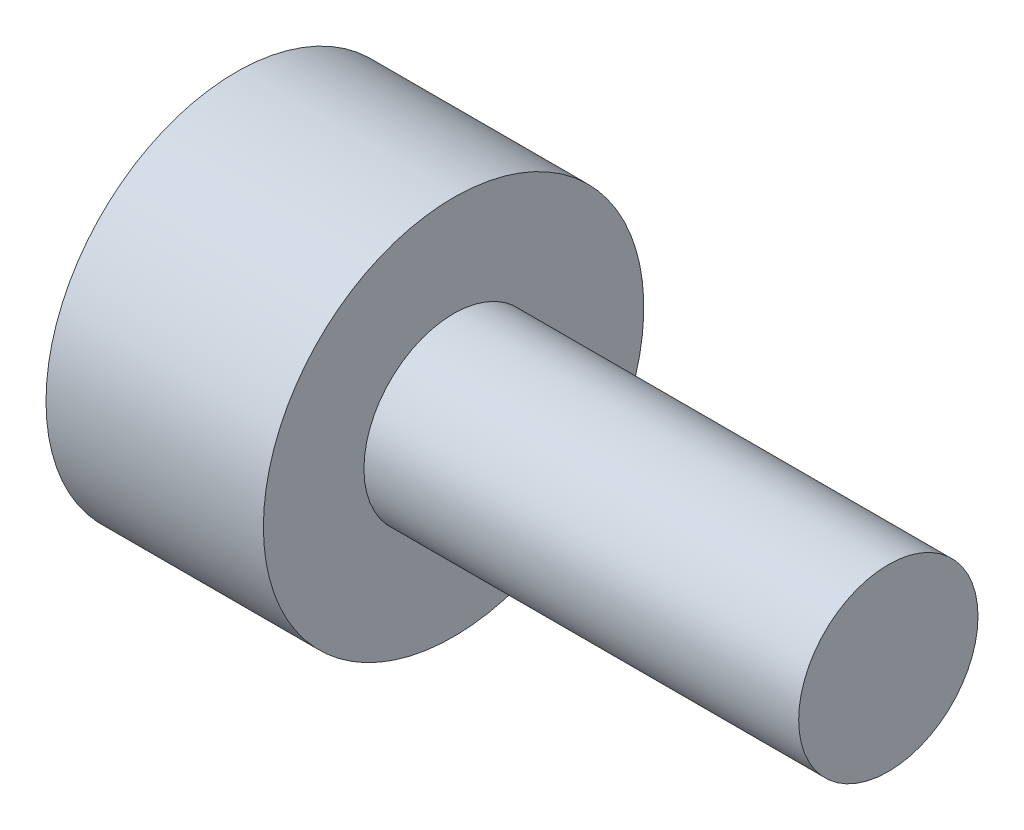
ISO-10303-21;
HEADER;
FILE_DESCRIPTION(('STEP AP214'),'2;1');
FILE_NAME('part.step','',(''),(''),'','','');
FILE_SCHEMA(('AUTOMOTIVE_DESIGN { 1 0 10303 214 1 1 1 1 }'));
ENDSEC;
DATA;
#1=APPLICATION_CONTEXT('core data for automotive mechanical design processes');
#2=APPLICATION_PROTOCOL_DEFINITION('international standard','automotive_design',2000,#1);
#3=PRODUCT_CONTEXT('',#1,'mechanical');
#4=PRODUCT('Part','Part','',(#3));
#5=PRODUCT_RELATED_PRODUCT_CATEGORY('part','',(#4));
#6=PRODUCT_DEFINITION_FORMATION('','',#4);
#7=PRODUCT_DEFINITION_CONTEXT('part definition',#1,'design');
#8=PRODUCT_DEFINITION('design','',#6,#7);
#9=PRODUCT_DEFINITION_SHAPE('','',#8);
#10=(LENGTH_UNIT() NAMED_UNIT(*) SI_UNIT(.MILLI.,.METRE.));
#11=(NAMED_UNIT(*) PLANE_ANGLE_UNIT() SI_UNIT($,.RADIAN.));
#12=(NAMED_UNIT(*) SI_UNIT($,.STERADIAN.) SOLID_ANGLE_UNIT());
#13=UNCERTAINTY_MEASURE_WITH_UNIT(LENGTH_MEASURE(1.E-05),#10,'distance_accuracy_value','');
#14=(GEOMETRIC_REPRESENTATION_CONTEXT(3) GLOBAL_UNCERTAINTY_ASSIGNED_CONTEXT((#13)) GLOBAL_UNIT_ASSIGNED_CONTEXT((#10,
#11,#12)) REPRESENTATION_CONTEXT('',''));
#15=CARTESIAN_POINT('',(0.,0.,0.));
#16=DIRECTION('',(0.,0.,1.));
#17=DIRECTION('',(1.,0.,0.));
#18=AXIS2_PLACEMENT_3D('',#15,#16,#17);
#19=CARTESIAN_POINT('',(-4.,0.,0.));
#20=DIRECTION('',(1.,0.,0.));
#21=DIRECTION('',(0.,0.,-1.));
#22=AXIS2_PLACEMENT_3D('',#19,#20,#21);
#23=PLANE('',#22);
#24=CARTESIAN_POINT('',(-4.,0.,0.));
#25=DIRECTION('',(-1.,0.,0.));
#26=DIRECTION('',(0.,0.,1.));
#27=AXIS2_PLACEMENT_3D('',#24,#25,#26);
#28=CIRCLE('',#27,3.5);
#29=CARTESIAN_POINT('',(-4.,0.,3.5));
#30=VERTEX_POINT('',#29);
#31=EDGE_CURVE('E11',#30,#30,#28,.T.);
#32=ORIENTED_EDGE('',*,*,#31,.T.);
#33=EDGE_LOOP('',(#32));
#34=FACE_BOUND('',#33,.T.);
#35=DIRECTION('',(0.,0.866025403784439,-0.5));
#36=VECTOR('',#35,1.);
#37=CARTESIAN_POINT('',(-4.,-1.5,-0.866025403784439));
#38=LINE('',#37,#36);
#39=CARTESIAN_POINT('',(-4.,-1.5,-0.866025403784439));
#40=VERTEX_POINT('',#39);
#41=CARTESIAN_POINT('',(-4.,0.,-1.73205080756888));
#42=VERTEX_POINT('',#41);
#43=EDGE_CURVE('E54',#40,#42,#38,.T.);
#44=ORIENTED_EDGE('',*,*,#43,.T.);
#45=DIRECTION('',(0.,0.866025403784439,0.5));
#46=VECTOR('',#45,1.);
#47=CARTESIAN_POINT('',(-4.,0.,-1.73205080756888));
#48=LINE('',#47,#46);
#49=CARTESIAN_POINT('',(-4.,1.5,-0.866025403784439));
#50=VERTEX_POINT('',#49);
#51=EDGE_CURVE('E129',#42,#50,#48,.T.);
#52=ORIENTED_EDGE('',*,*,#51,.T.);
#53=DIRECTION('',(0.,0.,1.));
#54=VECTOR('',#53,1.);
#55=CARTESIAN_POINT('',(-4.,1.5,-0.866025403784439));
#56=LINE('',#55,#54);
#57=CARTESIAN_POINT('',(-4.,1.5,0.866025403784438));
#58=VERTEX_POINT('',#57);
#59=EDGE_CURVE('E128',#50,#58,#56,.T.);
#60=ORIENTED_EDGE('',*,*,#59,.T.);
#61=DIRECTION('',(0.,-0.866025403784438,0.5));
#62=VECTOR('',#61,1.);
#63=CARTESIAN_POINT('',(-4.,1.5,0.866025403784438));
#64=LINE('',#63,#62);
#65=CARTESIAN_POINT('',(-4.,0.,1.73205080756888));
#66=VERTEX_POINT('',#65);
#67=EDGE_CURVE('E132',#58,#66,#64,.T.);
#68=ORIENTED_EDGE('',*,*,#67,.T.);
#69=DIRECTION('',(0.,-0.866025403784439,-0.5));
#70=VECTOR('',#69,1.);
#71=CARTESIAN_POINT('',(-4.,0.,1.73205080756888));
#72=LINE('',#71,#70);
#73=CARTESIAN_POINT('',(-4.,-1.5,0.866025403784439));
#74=VERTEX_POINT('',#73);
#75=EDGE_CURVE('E116',#66,#74,#72,.T.);
#76=ORIENTED_EDGE('',*,*,#75,.T.);
#77=DIRECTION('',(0.,0.,-1.));
#78=VECTOR('',#77,1.);
#79=CARTESIAN_POINT('',(-4.,-1.5,0.866025403784439));
#80=LINE('',#79,#78);
#81=EDGE_CURVE('E135',#74,#40,#80,.T.);
#82=ORIENTED_EDGE('',*,*,#81,.T.);
#83=EDGE_LOOP('',(#44,#52,#60,#68,#76,#82));
#84=FACE_BOUND('',#83,.T.);
#85=ADVANCED_FACE('F41',(#34,#84),#23,.F.);
#86=CARTESIAN_POINT('',(-1000.,0.,0.));
#87=DIRECTION('',(-1.,0.,0.));
#88=DIRECTION('',(0.,0.,1.));
#89=AXIS2_PLACEMENT_3D('',#86,#87,#88);
#90=CYLINDRICAL_SURFACE('',#89,3.5);
#91=ORIENTED_EDGE('',*,*,#31,.F.);
#92=EDGE_LOOP('',(#91));
#93=FACE_BOUND('',#92,.T.);
#94=CARTESIAN_POINT('',(0.,0.,0.));
#95=DIRECTION('',(-1.,0.,0.));
#96=DIRECTION('',(0.,0.,1.));
#97=AXIS2_PLACEMENT_3D('',#94,#95,#96);
#98=CIRCLE('',#97,3.5);
#99=CARTESIAN_POINT('',(0.,0.,3.5));
#100=VERTEX_POINT('',#99);
#101=EDGE_CURVE('E48',#100,#100,#98,.T.);
#102=ORIENTED_EDGE('',*,*,#101,.T.);
#103=EDGE_LOOP('',(#102));
#104=FACE_BOUND('',#103,.T.);
#105=ADVANCED_FACE('F153',(#93,#104),#90,.T.);
#106=CARTESIAN_POINT('',(0.,3.5,0.));
#107=DIRECTION('',(-1.,0.,0.));
#108=DIRECTION('',(0.,0.,1.));
#109=AXIS2_PLACEMENT_3D('',#106,#107,#108);
#110=PLANE('',#109);
#111=ORIENTED_EDGE('',*,*,#101,.F.);
#112=EDGE_LOOP('',(#111));
#113=FACE_BOUND('',#112,.T.);
#114=CARTESIAN_POINT('',(0.,0.,0.));
#115=DIRECTION('',(-1.,0.,0.));
#116=DIRECTION('',(0.,0.,1.));
#117=AXIS2_PLACEMENT_3D('',#114,#115,#116);
#118=CIRCLE('',#117,1.65);
#119=CARTESIAN_POINT('',(0.,0.,1.65));
#120=VERTEX_POINT('',#119);
#121=EDGE_CURVE('E148',#120,#120,#118,.T.);
#122=ORIENTED_EDGE('',*,*,#121,.T.);
#123=EDGE_LOOP('',(#122));
#124=FACE_BOUND('',#123,.T.);
#125=ADVANCED_FACE('F156',(#113,#124),#110,.F.);
#126=CARTESIAN_POINT('',(-1000.,0.,0.));
#127=DIRECTION('',(-1.,0.,0.));
#128=DIRECTION('',(0.,0.,1.));
#129=AXIS2_PLACEMENT_3D('',#126,#127,#128);
#130=CYLINDRICAL_SURFACE('',#129,1.65);
#131=ORIENTED_EDGE('',*,*,#121,.F.);
#132=EDGE_LOOP('',(#131));
#133=FACE_BOUND('',#132,.T.);
#134=CARTESIAN_POINT('',(8.00000000000001,0.,0.));
#135=DIRECTION('',(-1.,0.,0.));
#136=DIRECTION('',(0.,0.,1.));
#137=AXIS2_PLACEMENT_3D('',#134,#135,#136);
#138=CIRCLE('',#137,1.65);
#139=CARTESIAN_POINT('',(8.00000000000001,0.,1.65));
#140=VERTEX_POINT('',#139);
#141=EDGE_CURVE('E149',#140,#140,#138,.T.);
#142=ORIENTED_EDGE('',*,*,#141,.T.);
#143=EDGE_LOOP('',(#142));
#144=FACE_BOUND('',#143,.T.);
#145=ADVANCED_FACE('F158',(#133,#144),#130,.T.);
#146=CARTESIAN_POINT('',(8.,1.65,0.));
#147=DIRECTION('',(-1.,0.,0.));
#148=DIRECTION('',(0.,0.,1.));
#149=AXIS2_PLACEMENT_3D('',#146,#147,#148);
#150=PLANE('',#149);
#151=ORIENTED_EDGE('',*,*,#141,.F.);
#152=EDGE_LOOP('',(#151));
#153=FACE_BOUND('',#152,.T.);
#154=ADVANCED_FACE('F164',(#153),#150,.F.);
#155=CARTESIAN_POINT('',(-2.,-1.5,-0.866025403784439));
#156=DIRECTION('',(0.,0.5,0.866025403784439));
#157=DIRECTION('',(0.,-0.866025403784439,0.5));
#158=AXIS2_PLACEMENT_3D('',#155,#156,#157);
#159=PLANE('',#158);
#160=ORIENTED_EDGE('',*,*,#43,.F.);
#161=DIRECTION('',(-1.,0.,0.));
#162=VECTOR('',#161,1.);
#163=CARTESIAN_POINT('',(-2.,-1.5,-0.866025403784439));
#164=LINE('',#163,#162);
#165=CARTESIAN_POINT('',(-2.,-1.5,-0.866025403784439));
#166=VERTEX_POINT('',#165);
#167=EDGE_CURVE('E122',#166,#40,#164,.T.);
#168=ORIENTED_EDGE('',*,*,#167,.F.);
#169=DIRECTION('',(0.,0.866025403784439,-0.5));
#170=VECTOR('',#169,1.);
#171=CARTESIAN_POINT('',(-2.,-1.5,-0.866025403784439));
#172=LINE('',#171,#170);
#173=CARTESIAN_POINT('',(-2.,0.,-1.73205080756888));
#174=VERTEX_POINT('',#173);
#175=EDGE_CURVE('E137',#166,#174,#172,.T.);
#176=ORIENTED_EDGE('',*,*,#175,.T.);
#177=DIRECTION('',(-1.,0.,0.));
#178=VECTOR('',#177,1.);
#179=CARTESIAN_POINT('',(-2.,0.,-1.73205080756888));
#180=LINE('',#179,#178);
#181=EDGE_CURVE('E144',#174,#42,#180,.T.);
#182=ORIENTED_EDGE('',*,*,#181,.T.);
#183=EDGE_LOOP('',(#160,#168,#176,#182));
#184=FACE_BOUND('',#183,.T.);
#185=ADVANCED_FACE('F167',(#184),#159,.T.);
#186=CARTESIAN_POINT('',(-2.,0.,-1.73205080756888));
#187=DIRECTION('',(0.,-0.5,0.866025403784439));
#188=DIRECTION('',(0.,-0.866025403784439,-0.5));
#189=AXIS2_PLACEMENT_3D('',#186,#187,#188);
#190=PLANE('',#189);
#191=ORIENTED_EDGE('',*,*,#51,.F.);
#192=ORIENTED_EDGE('',*,*,#181,.F.);
#193=DIRECTION('',(0.,0.866025403784439,0.5));
#194=VECTOR('',#193,1.);
#195=CARTESIAN_POINT('',(-2.,0.,-1.73205080756888));
#196=LINE('',#195,#194);
#197=CARTESIAN_POINT('',(-2.,1.5,-0.866025403784439));
#198=VERTEX_POINT('',#197);
#199=EDGE_CURVE('E93',#174,#198,#196,.T.);
#200=ORIENTED_EDGE('',*,*,#199,.T.);
#201=DIRECTION('',(-1.,0.,0.));
#202=VECTOR('',#201,1.);
#203=CARTESIAN_POINT('',(-2.,1.5,-0.866025403784439));
#204=LINE('',#203,#202);
#205=EDGE_CURVE('E145',#198,#50,#204,.T.);
#206=ORIENTED_EDGE('',*,*,#205,.T.);
#207=EDGE_LOOP('',(#191,#192,#200,#206));
#208=FACE_BOUND('',#207,.T.);
#209=ADVANCED_FACE('F176',(#208),#190,.T.);
#210=CARTESIAN_POINT('',(-2.,1.5,-0.866025403784439));
#211=DIRECTION('',(0.,-1.,0.));
#212=DIRECTION('',(0.,0.,-1.));
#213=AXIS2_PLACEMENT_3D('',#210,#211,#212);
#214=PLANE('',#213);
#215=ORIENTED_EDGE('',*,*,#59,.F.);
#216=ORIENTED_EDGE('',*,*,#205,.F.);
#217=DIRECTION('',(0.,0.,1.));
#218=VECTOR('',#217,1.);
#219=CARTESIAN_POINT('',(-2.,1.5,-0.866025403784439));
#220=LINE('',#219,#218);
#221=CARTESIAN_POINT('',(-2.,1.5,0.866025403784438));
#222=VERTEX_POINT('',#221);
#223=EDGE_CURVE('E115',#198,#222,#220,.T.);
#224=ORIENTED_EDGE('',*,*,#223,.T.);
#225=DIRECTION('',(-1.,0.,0.));
#226=VECTOR('',#225,1.);
#227=CARTESIAN_POINT('',(-2.,1.5,0.866025403784438));
#228=LINE('',#227,#226);
#229=EDGE_CURVE('E107',#222,#58,#228,.T.);
#230=ORIENTED_EDGE('',*,*,#229,.T.);
#231=EDGE_LOOP('',(#215,#216,#224,#230));
#232=FACE_BOUND('',#231,.T.);
#233=ADVANCED_FACE('F191',(#232),#214,.T.);
#234=CARTESIAN_POINT('',(-2.,1.5,0.866025403784438));
#235=DIRECTION('',(0.,-0.5,-0.866025403784439));
#236=DIRECTION('',(0.,0.866025403784438,-0.5));
#237=AXIS2_PLACEMENT_3D('',#234,#235,#236);
#238=PLANE('',#237);
#239=ORIENTED_EDGE('',*,*,#67,.F.);
#240=ORIENTED_EDGE('',*,*,#229,.F.);
#241=DIRECTION('',(0.,-0.866025403784438,0.5));
#242=VECTOR('',#241,1.);
#243=CARTESIAN_POINT('',(-2.,1.5,0.866025403784438));
#244=LINE('',#243,#242);
#245=CARTESIAN_POINT('',(-2.,0.,1.73205080756888));
#246=VERTEX_POINT('',#245);
#247=EDGE_CURVE('E104',#222,#246,#244,.T.);
#248=ORIENTED_EDGE('',*,*,#247,.T.);
#249=DIRECTION('',(-1.,0.,0.));
#250=VECTOR('',#249,1.);
#251=CARTESIAN_POINT('',(-2.,0.,1.73205080756888));
#252=LINE('',#251,#250);
#253=EDGE_CURVE('E108',#246,#66,#252,.T.);
#254=ORIENTED_EDGE('',*,*,#253,.T.);
#255=EDGE_LOOP('',(#239,#240,#248,#254));
#256=FACE_BOUND('',#255,.T.);
#257=ADVANCED_FACE('F110',(#256),#238,.T.);
#258=CARTESIAN_POINT('',(-2.,0.,1.73205080756888));
#259=DIRECTION('',(0.,0.5,-0.866025403784439));
#260=DIRECTION('',(0.,0.866025403784439,0.5));
#261=AXIS2_PLACEMENT_3D('',#258,#259,#260);
#262=PLANE('',#261);
#263=ORIENTED_EDGE('',*,*,#75,.F.);
#264=ORIENTED_EDGE('',*,*,#253,.F.);
#265=DIRECTION('',(0.,-0.866025403784439,-0.5));
#266=VECTOR('',#265,1.);
#267=CARTESIAN_POINT('',(-2.,0.,1.73205080756888));
#268=LINE('',#267,#266);
#269=CARTESIAN_POINT('',(-2.,-1.5,0.866025403784439));
#270=VERTEX_POINT('',#269);
#271=EDGE_CURVE('E111',#246,#270,#268,.T.);
#272=ORIENTED_EDGE('',*,*,#271,.T.);
#273=DIRECTION('',(-1.,0.,0.));
#274=VECTOR('',#273,1.);
#275=CARTESIAN_POINT('',(-2.,-1.5,0.866025403784439));
#276=LINE('',#275,#274);
#277=EDGE_CURVE('E82',#270,#74,#276,.T.);
#278=ORIENTED_EDGE('',*,*,#277,.T.);
#279=EDGE_LOOP('',(#263,#264,#272,#278));
#280=FACE_BOUND('',#279,.T.);
#281=ADVANCED_FACE('F112',(#280),#262,.T.);
#282=CARTESIAN_POINT('',(-2.,-1.5,0.866025403784439));
#283=DIRECTION('',(0.,1.,0.));
#284=DIRECTION('',(0.,0.,1.));
#285=AXIS2_PLACEMENT_3D('',#282,#283,#284);
#286=PLANE('',#285);
#287=ORIENTED_EDGE('',*,*,#81,.F.);
#288=ORIENTED_EDGE('',*,*,#277,.F.);
#289=DIRECTION('',(0.,0.,-1.));
#290=VECTOR('',#289,1.);
#291=CARTESIAN_POINT('',(-2.,-1.5,0.866025403784439));
#292=LINE('',#291,#290);
#293=EDGE_CURVE('E65',#270,#166,#292,.T.);
#294=ORIENTED_EDGE('',*,*,#293,.T.);
#295=ORIENTED_EDGE('',*,*,#167,.T.);
#296=EDGE_LOOP('',(#287,#288,#294,#295));
#297=FACE_BOUND('',#296,.T.);
#298=ADVANCED_FACE('F184',(#297),#286,.T.);
#299=CARTESIAN_POINT('',(-2.,0.,0.));
#300=DIRECTION('',(1.,0.,0.));
#301=DIRECTION('',(0.,0.,-1.));
#302=AXIS2_PLACEMENT_3D('',#299,#300,#301);
#303=PLANE('',#302);
#304=ORIENTED_EDGE('',*,*,#175,.F.);
#305=ORIENTED_EDGE('',*,*,#293,.F.);
#306=ORIENTED_EDGE('',*,*,#271,.F.);
#307=ORIENTED_EDGE('',*,*,#247,.F.);
#308=ORIENTED_EDGE('',*,*,#223,.F.);
#309=ORIENTED_EDGE('',*,*,#199,.F.);
#310=EDGE_LOOP('',(#304,#305,#306,#307,#308,#309));
#311=FACE_BOUND('',#310,.T.);
#312=ADVANCED_FACE('F118',(#311),#303,.F.);
#313=CLOSED_SHELL('',(#85,#105,#125,#145,#154,#185,#209,#233,#257,#281,#298,#312));
#314=MANIFOLD_SOLID_BREP('B2',#313);
#315=ADVANCED_BREP_SHAPE_REPRESENTATION('',(#18,#314),#14);
#316=SHAPE_DEFINITION_REPRESENTATION(#9,#315);
ENDSEC;
END-ISO-10303-21;
